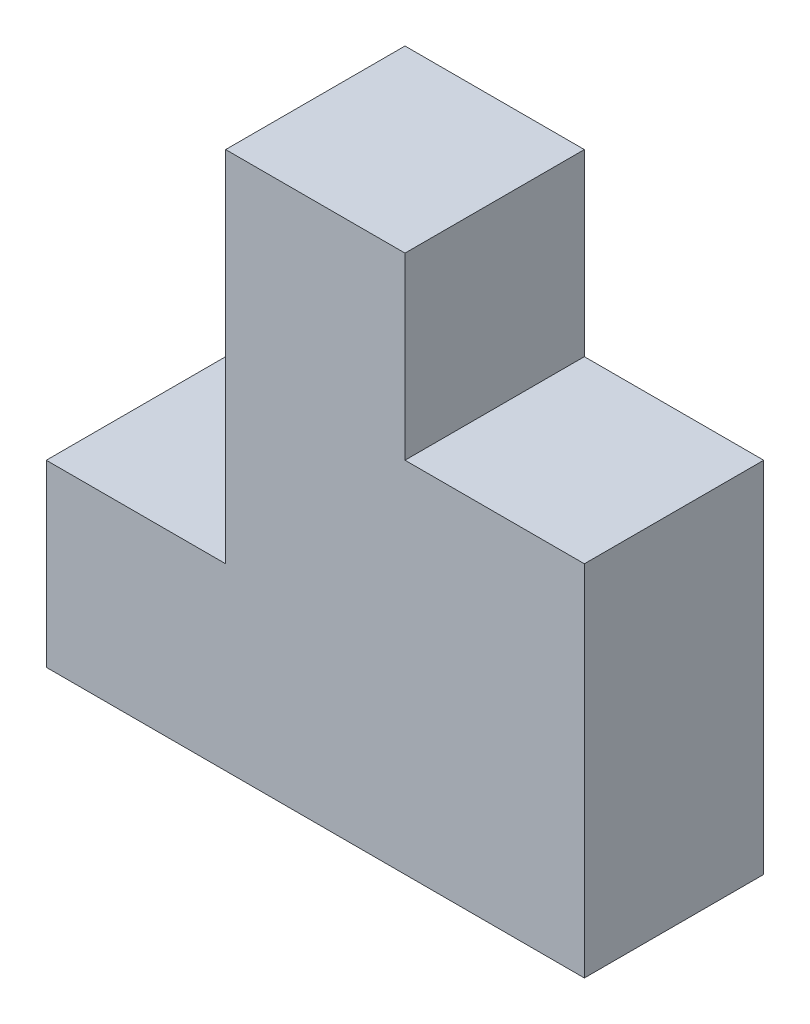
ISO-10303-21;
HEADER;
FILE_DESCRIPTION(('STEP AP214'),'2;1');
FILE_NAME('part.step','',(''),(''),'','','');
FILE_SCHEMA(('AUTOMOTIVE_DESIGN { 1 0 10303 214 1 1 1 1 }'));
ENDSEC;
DATA;
#1=APPLICATION_CONTEXT('core data for automotive mechanical design processes');
#2=APPLICATION_PROTOCOL_DEFINITION('international standard','automotive_design',2000,#1);
#3=PRODUCT_CONTEXT('',#1,'mechanical');
#4=PRODUCT('Part','Part','',(#3));
#5=PRODUCT_RELATED_PRODUCT_CATEGORY('part','',(#4));
#6=PRODUCT_DEFINITION_FORMATION('','',#4);
#7=PRODUCT_DEFINITION_CONTEXT('part definition',#1,'design');
#8=PRODUCT_DEFINITION('design','',#6,#7);
#9=PRODUCT_DEFINITION_SHAPE('','',#8);
#10=(LENGTH_UNIT() NAMED_UNIT(*) SI_UNIT(.MILLI.,.METRE.));
#11=(NAMED_UNIT(*) PLANE_ANGLE_UNIT() SI_UNIT($,.RADIAN.));
#12=(NAMED_UNIT(*) SI_UNIT($,.STERADIAN.) SOLID_ANGLE_UNIT());
#13=UNCERTAINTY_MEASURE_WITH_UNIT(LENGTH_MEASURE(1.E-05),#10,'distance_accuracy_value','');
#14=(GEOMETRIC_REPRESENTATION_CONTEXT(3) GLOBAL_UNCERTAINTY_ASSIGNED_CONTEXT((#13)) GLOBAL_UNIT_ASSIGNED_CONTEXT((#10,
#11,#12)) REPRESENTATION_CONTEXT('',''));
#15=CARTESIAN_POINT('',(0.,0.,0.));
#16=DIRECTION('',(0.,0.,1.));
#17=DIRECTION('',(1.,0.,0.));
#18=AXIS2_PLACEMENT_3D('',#15,#16,#17);
#19=CARTESIAN_POINT('',(0.,19.05,19.05));
#20=DIRECTION('',(1.,0.,0.));
#21=DIRECTION('',(0.,0.,-1.));
#22=AXIS2_PLACEMENT_3D('',#19,#20,#21);
#23=PLANE('',#22);
#24=DIRECTION('',(0.,-1.,0.));
#25=VECTOR('',#24,1.);
#26=CARTESIAN_POINT('',(0.,19.05,0.));
#27=LINE('',#26,#25);
#28=CARTESIAN_POINT('',(0.,19.05,0.));
#29=VERTEX_POINT('',#28);
#30=CARTESIAN_POINT('',(0.,0.,0.));
#31=VERTEX_POINT('',#30);
#32=EDGE_CURVE('E137',#29,#31,#27,.T.);
#33=ORIENTED_EDGE('',*,*,#32,.T.);
#34=DIRECTION('',(0.,0.,-1.));
#35=VECTOR('',#34,1.);
#36=CARTESIAN_POINT('',(0.,0.,19.05));
#37=LINE('',#36,#35);
#38=CARTESIAN_POINT('',(0.,0.,19.05));
#39=VERTEX_POINT('',#38);
#40=EDGE_CURVE('E11',#39,#31,#37,.T.);
#41=ORIENTED_EDGE('',*,*,#40,.F.);
#42=DIRECTION('',(0.,-1.,0.));
#43=VECTOR('',#42,1.);
#44=CARTESIAN_POINT('',(0.,19.05,19.05));
#45=LINE('',#44,#43);
#46=CARTESIAN_POINT('',(0.,19.05,19.05));
#47=VERTEX_POINT('',#46);
#48=EDGE_CURVE('E154',#47,#39,#45,.T.);
#49=ORIENTED_EDGE('',*,*,#48,.F.);
#50=DIRECTION('',(0.,0.,-1.));
#51=VECTOR('',#50,1.);
#52=CARTESIAN_POINT('',(0.,19.05,19.05));
#53=LINE('',#52,#51);
#54=EDGE_CURVE('E134',#47,#29,#53,.T.);
#55=ORIENTED_EDGE('',*,*,#54,.T.);
#56=EDGE_LOOP('',(#33,#41,#49,#55));
#57=FACE_BOUND('',#56,.T.);
#58=ADVANCED_FACE('F43',(#57),#23,.F.);
#59=CARTESIAN_POINT('',(0.,0.,19.05));
#60=DIRECTION('',(0.,1.,0.));
#61=DIRECTION('',(0.,0.,1.));
#62=AXIS2_PLACEMENT_3D('',#59,#60,#61);
#63=PLANE('',#62);
#64=DIRECTION('',(1.,0.,0.));
#65=VECTOR('',#64,1.);
#66=CARTESIAN_POINT('',(0.,0.,0.));
#67=LINE('',#66,#65);
#68=CARTESIAN_POINT('',(57.15,0.,0.));
#69=VERTEX_POINT('',#68);
#70=EDGE_CURVE('E145',#31,#69,#67,.T.);
#71=ORIENTED_EDGE('',*,*,#70,.T.);
#72=DIRECTION('',(0.,0.,-1.));
#73=VECTOR('',#72,1.);
#74=CARTESIAN_POINT('',(57.15,0.,19.05));
#75=LINE('',#74,#73);
#76=CARTESIAN_POINT('',(57.15,0.,19.05));
#77=VERTEX_POINT('',#76);
#78=EDGE_CURVE('E51',#77,#69,#75,.T.);
#79=ORIENTED_EDGE('',*,*,#78,.F.);
#80=DIRECTION('',(1.,0.,0.));
#81=VECTOR('',#80,1.);
#82=CARTESIAN_POINT('',(0.,0.,19.05));
#83=LINE('',#82,#81);
#84=EDGE_CURVE('E105',#39,#77,#83,.T.);
#85=ORIENTED_EDGE('',*,*,#84,.F.);
#86=ORIENTED_EDGE('',*,*,#40,.T.);
#87=EDGE_LOOP('',(#71,#79,#85,#86));
#88=FACE_BOUND('',#87,.T.);
#89=ADVANCED_FACE('F187',(#88),#63,.F.);
#90=CARTESIAN_POINT('',(57.15,0.,19.05));
#91=DIRECTION('',(-1.,0.,0.));
#92=DIRECTION('',(0.,0.,1.));
#93=AXIS2_PLACEMENT_3D('',#90,#91,#92);
#94=PLANE('',#93);
#95=DIRECTION('',(0.,1.,0.));
#96=VECTOR('',#95,1.);
#97=CARTESIAN_POINT('',(57.15,0.,0.));
#98=LINE('',#97,#96);
#99=CARTESIAN_POINT('',(57.15,38.1,0.));
#100=VERTEX_POINT('',#99);
#101=EDGE_CURVE('E143',#69,#100,#98,.T.);
#102=ORIENTED_EDGE('',*,*,#101,.T.);
#103=DIRECTION('',(0.,0.,-1.));
#104=VECTOR('',#103,1.);
#105=CARTESIAN_POINT('',(57.15,38.1,19.05));
#106=LINE('',#105,#104);
#107=CARTESIAN_POINT('',(57.15,38.1,19.05));
#108=VERTEX_POINT('',#107);
#109=EDGE_CURVE('E158',#108,#100,#106,.T.);
#110=ORIENTED_EDGE('',*,*,#109,.F.);
#111=DIRECTION('',(0.,1.,0.));
#112=VECTOR('',#111,1.);
#113=CARTESIAN_POINT('',(57.15,0.,19.05));
#114=LINE('',#113,#112);
#115=EDGE_CURVE('E166',#77,#108,#114,.T.);
#116=ORIENTED_EDGE('',*,*,#115,.F.);
#117=ORIENTED_EDGE('',*,*,#78,.T.);
#118=EDGE_LOOP('',(#102,#110,#116,#117));
#119=FACE_BOUND('',#118,.T.);
#120=ADVANCED_FACE('F168',(#119),#94,.F.);
#121=CARTESIAN_POINT('',(57.15,38.1,19.05));
#122=DIRECTION('',(0.,-1.,0.));
#123=DIRECTION('',(0.,0.,-1.));
#124=AXIS2_PLACEMENT_3D('',#121,#122,#123);
#125=PLANE('',#124);
#126=DIRECTION('',(-1.,0.,0.));
#127=VECTOR('',#126,1.);
#128=CARTESIAN_POINT('',(57.15,38.1,0.));
#129=LINE('',#128,#127);
#130=CARTESIAN_POINT('',(38.1,38.1,0.));
#131=VERTEX_POINT('',#130);
#132=EDGE_CURVE('E147',#100,#131,#129,.T.);
#133=ORIENTED_EDGE('',*,*,#132,.T.);
#134=DIRECTION('',(0.,0.,-1.));
#135=VECTOR('',#134,1.);
#136=CARTESIAN_POINT('',(38.1,38.1,19.05));
#137=LINE('',#136,#135);
#138=CARTESIAN_POINT('',(38.1,38.1,19.05));
#139=VERTEX_POINT('',#138);
#140=EDGE_CURVE('E160',#139,#131,#137,.T.);
#141=ORIENTED_EDGE('',*,*,#140,.F.);
#142=DIRECTION('',(-1.,0.,0.));
#143=VECTOR('',#142,1.);
#144=CARTESIAN_POINT('',(57.15,38.1,19.05));
#145=LINE('',#144,#143);
#146=EDGE_CURVE('E179',#108,#139,#145,.T.);
#147=ORIENTED_EDGE('',*,*,#146,.F.);
#148=ORIENTED_EDGE('',*,*,#109,.T.);
#149=EDGE_LOOP('',(#133,#141,#147,#148));
#150=FACE_BOUND('',#149,.T.);
#151=ADVANCED_FACE('F176',(#150),#125,.F.);
#152=CARTESIAN_POINT('',(38.1,38.1,19.05));
#153=DIRECTION('',(-1.,0.,0.));
#154=DIRECTION('',(0.,0.,1.));
#155=AXIS2_PLACEMENT_3D('',#152,#153,#154);
#156=PLANE('',#155);
#157=DIRECTION('',(0.,1.,0.));
#158=VECTOR('',#157,1.);
#159=CARTESIAN_POINT('',(38.1,38.1,0.));
#160=LINE('',#159,#158);
#161=CARTESIAN_POINT('',(38.1,57.15,0.));
#162=VERTEX_POINT('',#161);
#163=EDGE_CURVE('E149',#131,#162,#160,.T.);
#164=ORIENTED_EDGE('',*,*,#163,.T.);
#165=DIRECTION('',(0.,0.,-1.));
#166=VECTOR('',#165,1.);
#167=CARTESIAN_POINT('',(38.1,57.15,19.05));
#168=LINE('',#167,#166);
#169=CARTESIAN_POINT('',(38.1,57.15,19.05));
#170=VERTEX_POINT('',#169);
#171=EDGE_CURVE('E127',#170,#162,#168,.T.);
#172=ORIENTED_EDGE('',*,*,#171,.F.);
#173=DIRECTION('',(0.,1.,0.));
#174=VECTOR('',#173,1.);
#175=CARTESIAN_POINT('',(38.1,38.1,19.05));
#176=LINE('',#175,#174);
#177=EDGE_CURVE('E123',#139,#170,#176,.T.);
#178=ORIENTED_EDGE('',*,*,#177,.F.);
#179=ORIENTED_EDGE('',*,*,#140,.T.);
#180=EDGE_LOOP('',(#164,#172,#178,#179));
#181=FACE_BOUND('',#180,.T.);
#182=ADVANCED_FACE('F177',(#181),#156,.F.);
#183=CARTESIAN_POINT('',(38.1,57.15,19.05));
#184=DIRECTION('',(0.,-1.,0.));
#185=DIRECTION('',(0.,0.,-1.));
#186=AXIS2_PLACEMENT_3D('',#183,#184,#185);
#187=PLANE('',#186);
#188=DIRECTION('',(-1.,0.,0.));
#189=VECTOR('',#188,1.);
#190=CARTESIAN_POINT('',(38.1,57.15,0.));
#191=LINE('',#190,#189);
#192=CARTESIAN_POINT('',(19.05,57.15,0.));
#193=VERTEX_POINT('',#192);
#194=EDGE_CURVE('E129',#162,#193,#191,.T.);
#195=ORIENTED_EDGE('',*,*,#194,.T.);
#196=DIRECTION('',(0.,0.,-1.));
#197=VECTOR('',#196,1.);
#198=CARTESIAN_POINT('',(19.05,57.15,19.05));
#199=LINE('',#198,#197);
#200=CARTESIAN_POINT('',(19.05,57.15,19.05));
#201=VERTEX_POINT('',#200);
#202=EDGE_CURVE('E128',#201,#193,#199,.T.);
#203=ORIENTED_EDGE('',*,*,#202,.F.);
#204=DIRECTION('',(-1.,0.,0.));
#205=VECTOR('',#204,1.);
#206=CARTESIAN_POINT('',(38.1,57.15,19.05));
#207=LINE('',#206,#205);
#208=EDGE_CURVE('E113',#170,#201,#207,.T.);
#209=ORIENTED_EDGE('',*,*,#208,.F.);
#210=ORIENTED_EDGE('',*,*,#171,.T.);
#211=EDGE_LOOP('',(#195,#203,#209,#210));
#212=FACE_BOUND('',#211,.T.);
#213=ADVANCED_FACE('F130',(#212),#187,.F.);
#214=CARTESIAN_POINT('',(19.05,57.15,19.05));
#215=DIRECTION('',(1.,0.,0.));
#216=DIRECTION('',(0.,1.,0.));
#217=AXIS2_PLACEMENT_3D('',#214,#215,#216);
#218=PLANE('',#217);
#219=DIRECTION('',(0.,-1.,0.));
#220=VECTOR('',#219,1.);
#221=CARTESIAN_POINT('',(19.05,57.15,0.));
#222=LINE('',#221,#220);
#223=CARTESIAN_POINT('',(19.05,19.05,0.));
#224=VERTEX_POINT('',#223);
#225=EDGE_CURVE('E88',#193,#224,#222,.T.);
#226=ORIENTED_EDGE('',*,*,#225,.T.);
#227=DIRECTION('',(0.,0.,-1.));
#228=VECTOR('',#227,1.);
#229=CARTESIAN_POINT('',(19.05,19.05,19.05));
#230=LINE('',#229,#228);
#231=CARTESIAN_POINT('',(19.05,19.05,19.05));
#232=VERTEX_POINT('',#231);
#233=EDGE_CURVE('E131',#232,#224,#230,.T.);
#234=ORIENTED_EDGE('',*,*,#233,.F.);
#235=DIRECTION('',(0.,-1.,0.));
#236=VECTOR('',#235,1.);
#237=CARTESIAN_POINT('',(19.05,57.15,19.05));
#238=LINE('',#237,#236);
#239=EDGE_CURVE('E118',#201,#232,#238,.T.);
#240=ORIENTED_EDGE('',*,*,#239,.F.);
#241=ORIENTED_EDGE('',*,*,#202,.T.);
#242=EDGE_LOOP('',(#226,#234,#240,#241));
#243=FACE_BOUND('',#242,.T.);
#244=ADVANCED_FACE('F133',(#243),#218,.F.);
#245=CARTESIAN_POINT('',(19.05,19.05,19.05));
#246=DIRECTION('',(0.,-1.,0.));
#247=DIRECTION('',(0.,0.,-1.));
#248=AXIS2_PLACEMENT_3D('',#245,#246,#247);
#249=PLANE('',#248);
#250=DIRECTION('',(-1.,0.,0.));
#251=VECTOR('',#250,1.);
#252=CARTESIAN_POINT('',(19.05,19.05,0.));
#253=LINE('',#252,#251);
#254=EDGE_CURVE('E92',#224,#29,#253,.T.);
#255=ORIENTED_EDGE('',*,*,#254,.T.);
#256=ORIENTED_EDGE('',*,*,#54,.F.);
#257=DIRECTION('',(-1.,0.,0.));
#258=VECTOR('',#257,1.);
#259=CARTESIAN_POINT('',(19.05,19.05,19.05));
#260=LINE('',#259,#258);
#261=EDGE_CURVE('E56',#232,#47,#260,.T.);
#262=ORIENTED_EDGE('',*,*,#261,.F.);
#263=ORIENTED_EDGE('',*,*,#233,.T.);
#264=EDGE_LOOP('',(#255,#256,#262,#263));
#265=FACE_BOUND('',#264,.T.);
#266=ADVANCED_FACE('F204',(#265),#249,.F.);
#267=CARTESIAN_POINT('',(0.,0.,19.05));
#268=DIRECTION('',(0.,0.,1.));
#269=DIRECTION('',(1.,0.,0.));
#270=AXIS2_PLACEMENT_3D('',#267,#268,#269);
#271=PLANE('',#270);
#272=ORIENTED_EDGE('',*,*,#48,.T.);
#273=ORIENTED_EDGE('',*,*,#84,.T.);
#274=ORIENTED_EDGE('',*,*,#115,.T.);
#275=ORIENTED_EDGE('',*,*,#146,.T.);
#276=ORIENTED_EDGE('',*,*,#177,.T.);
#277=ORIENTED_EDGE('',*,*,#208,.T.);
#278=ORIENTED_EDGE('',*,*,#239,.T.);
#279=ORIENTED_EDGE('',*,*,#261,.T.);
#280=EDGE_LOOP('',(#272,#273,#274,#275,#276,#277,#278,#279));
#281=FACE_BOUND('',#280,.T.);
#282=ADVANCED_FACE('F117',(#281),#271,.T.);
#283=CARTESIAN_POINT('',(0.,0.,0.));
#284=DIRECTION('',(0.,0.,1.));
#285=DIRECTION('',(1.,0.,0.));
#286=AXIS2_PLACEMENT_3D('',#283,#284,#285);
#287=PLANE('',#286);
#288=ORIENTED_EDGE('',*,*,#32,.F.);
#289=ORIENTED_EDGE('',*,*,#254,.F.);
#290=ORIENTED_EDGE('',*,*,#225,.F.);
#291=ORIENTED_EDGE('',*,*,#194,.F.);
#292=ORIENTED_EDGE('',*,*,#163,.F.);
#293=ORIENTED_EDGE('',*,*,#132,.F.);
#294=ORIENTED_EDGE('',*,*,#101,.F.);
#295=ORIENTED_EDGE('',*,*,#70,.F.);
#296=EDGE_LOOP('',(#288,#289,#290,#291,#292,#293,#294,#295));
#297=FACE_BOUND('',#296,.T.);
#298=ADVANCED_FACE('F175',(#297),#287,.F.);
#299=CLOSED_SHELL('',(#58,#89,#120,#151,#182,#213,#244,#266,#282,#298));
#300=MANIFOLD_SOLID_BREP('B2',#299);
#301=ADVANCED_BREP_SHAPE_REPRESENTATION('',(#18,#300),#14);
#302=SHAPE_DEFINITION_REPRESENTATION(#9,#301);
ENDSEC;
END-ISO-10303-21;
